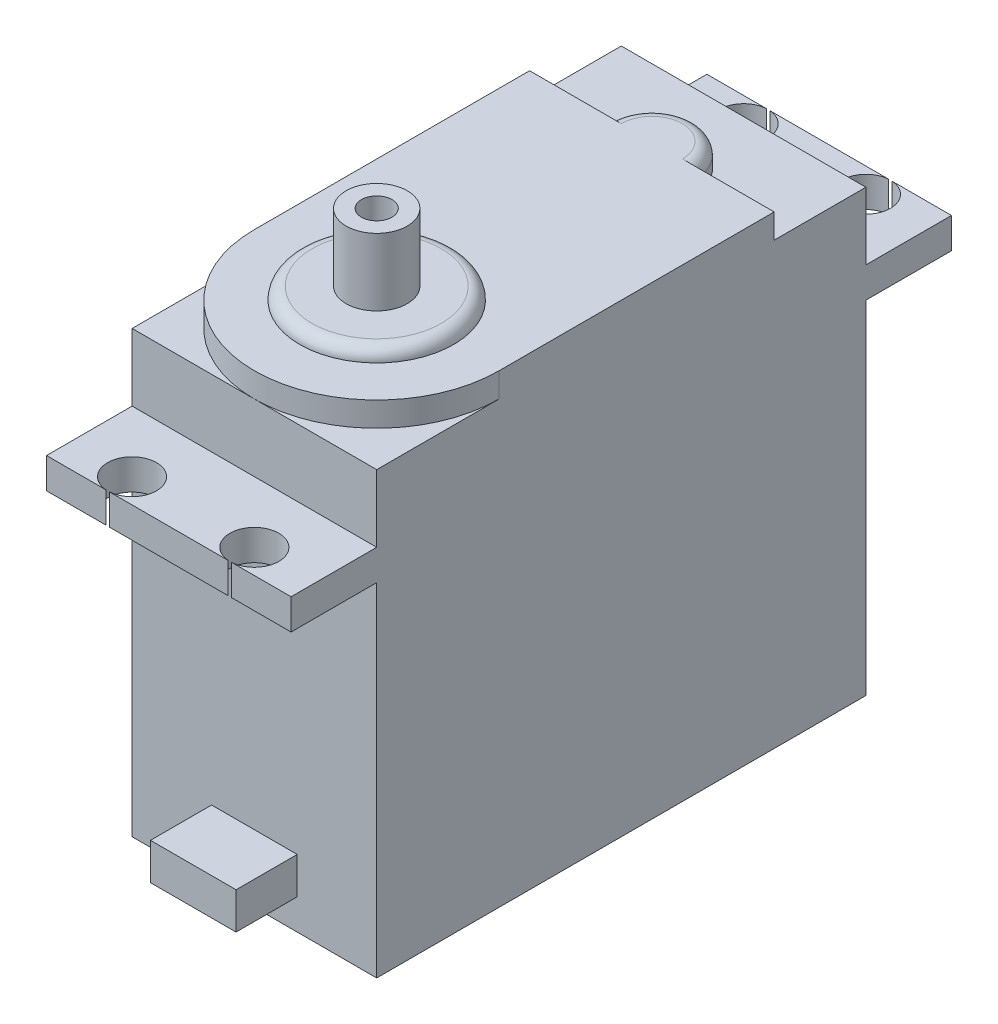
ISO-10303-21;
HEADER;
FILE_DESCRIPTION(('STEP AP214'),'2;1');
FILE_NAME('part.step','',(''),(''),'','','');
FILE_SCHEMA(('AUTOMOTIVE_DESIGN { 1 0 10303 214 1 1 1 1 }'));
ENDSEC;
DATA;
#1=APPLICATION_CONTEXT('core data for automotive mechanical design processes');
#2=APPLICATION_PROTOCOL_DEFINITION('international standard','automotive_design',2000,#1);
#3=PRODUCT_CONTEXT('',#1,'mechanical');
#4=PRODUCT('Part','Part','',(#3));
#5=PRODUCT_RELATED_PRODUCT_CATEGORY('part','',(#4));
#6=PRODUCT_DEFINITION_FORMATION('','',#4);
#7=PRODUCT_DEFINITION_CONTEXT('part definition',#1,'design');
#8=PRODUCT_DEFINITION('design','',#6,#7);
#9=PRODUCT_DEFINITION_SHAPE('','',#8);
#10=(LENGTH_UNIT() NAMED_UNIT(*) SI_UNIT(.MILLI.,.METRE.));
#11=(NAMED_UNIT(*) PLANE_ANGLE_UNIT() SI_UNIT($,.RADIAN.));
#12=(NAMED_UNIT(*) SI_UNIT($,.STERADIAN.) SOLID_ANGLE_UNIT());
#13=UNCERTAINTY_MEASURE_WITH_UNIT(LENGTH_MEASURE(1.E-05),#10,'distance_accuracy_value','');
#14=(GEOMETRIC_REPRESENTATION_CONTEXT(3) GLOBAL_UNCERTAINTY_ASSIGNED_CONTEXT((#13)) GLOBAL_UNIT_ASSIGNED_CONTEXT((#10,
#11,#12)) REPRESENTATION_CONTEXT('',''));
#15=CARTESIAN_POINT('',(0.,0.,0.));
#16=DIRECTION('',(0.,0.,1.));
#17=DIRECTION('',(1.,0.,0.));
#18=AXIS2_PLACEMENT_3D('',#15,#16,#17);
#19=CARTESIAN_POINT('',(0.,36.,0.));
#20=DIRECTION('',(0.,-1.,0.));
#21=DIRECTION('',(0.,0.,-1.));
#22=AXIS2_PLACEMENT_3D('',#19,#20,#21);
#23=PLANE('',#22);
#24=DIRECTION('',(-1.,0.,0.));
#25=VECTOR('',#24,1.);
#26=CARTESIAN_POINT('',(20.,36.,-32.5));
#27=LINE('',#26,#25);
#28=CARTESIAN_POINT('',(20.,36.,-32.5));
#29=VERTEX_POINT('',#28);
#30=CARTESIAN_POINT('',(13.5,36.,-32.5));
#31=VERTEX_POINT('',#30);
#32=EDGE_CURVE('E331',#29,#31,#27,.T.);
#33=ORIENTED_EDGE('',*,*,#32,.F.);
#34=DIRECTION('',(0.,0.,-1.));
#35=VECTOR('',#34,1.);
#36=CARTESIAN_POINT('',(20.,36.,0.));
#37=LINE('',#36,#35);
#38=CARTESIAN_POINT('',(20.,36.,-40.));
#39=VERTEX_POINT('',#38);
#40=EDGE_CURVE('E266',#29,#39,#37,.T.);
#41=ORIENTED_EDGE('',*,*,#40,.T.);
#42=DIRECTION('',(-1.,0.,0.));
#43=VECTOR('',#42,1.);
#44=CARTESIAN_POINT('',(0.,36.,-40.));
#45=LINE('',#44,#43);
#46=CARTESIAN_POINT('',(0.,36.,-40.));
#47=VERTEX_POINT('',#46);
#48=EDGE_CURVE('E491',#39,#47,#45,.T.);
#49=ORIENTED_EDGE('',*,*,#48,.T.);
#50=DIRECTION('',(0.,0.,1.));
#51=VECTOR('',#50,1.);
#52=CARTESIAN_POINT('',(0.,36.,0.));
#53=LINE('',#52,#51);
#54=CARTESIAN_POINT('',(0.,36.,-32.5));
#55=VERTEX_POINT('',#54);
#56=EDGE_CURVE('E398',#47,#55,#53,.T.);
#57=ORIENTED_EDGE('',*,*,#56,.T.);
#58=DIRECTION('',(-1.,0.,0.));
#59=VECTOR('',#58,1.);
#60=CARTESIAN_POINT('',(6.5,36.,-32.5));
#61=LINE('',#60,#59);
#62=CARTESIAN_POINT('',(6.5,36.,-32.5));
#63=VERTEX_POINT('',#62);
#64=EDGE_CURVE('E386',#63,#55,#61,.T.);
#65=ORIENTED_EDGE('',*,*,#64,.F.);
#66=CARTESIAN_POINT('',(10.,36.,-32.5));
#67=DIRECTION('',(0.,1.,0.));
#68=DIRECTION('',(0.,0.,1.));
#69=AXIS2_PLACEMENT_3D('',#66,#67,#68);
#70=CIRCLE('',#69,3.5);
#71=EDGE_CURVE('E419',#31,#63,#70,.T.);
#72=ORIENTED_EDGE('',*,*,#71,.F.);
#73=EDGE_LOOP('',(#33,#41,#49,#57,#65,#72));
#74=FACE_BOUND('',#73,.T.);
#75=ADVANCED_FACE('F36',(#74),#23,.F.);
#76=CARTESIAN_POINT('',(10.,36.,-10.));
#77=DIRECTION('',(0.,1.,0.));
#78=DIRECTION('',(0.,0.,1.));
#79=AXIS2_PLACEMENT_3D('',#76,#77,#78);
#80=CIRCLE('',#79,10.);
#81=CARTESIAN_POINT('',(0.,36.,-10.));
#82=VERTEX_POINT('',#81);
#83=CARTESIAN_POINT('',(10.,36.,0.));
#84=VERTEX_POINT('',#83);
#85=EDGE_CURVE('E260',#82,#84,#80,.T.);
#86=ORIENTED_EDGE('',*,*,#85,.F.);
#87=CARTESIAN_POINT('',(0.,36.,0.));
#88=VERTEX_POINT('',#87);
#89=EDGE_CURVE('E401',#82,#88,#53,.T.);
#90=ORIENTED_EDGE('',*,*,#89,.T.);
#91=DIRECTION('',(1.,0.,0.));
#92=VECTOR('',#91,1.);
#93=CARTESIAN_POINT('',(0.,36.,0.));
#94=LINE('',#93,#92);
#95=EDGE_CURVE('E393',#88,#84,#94,.T.);
#96=ORIENTED_EDGE('',*,*,#95,.T.);
#97=EDGE_LOOP('',(#86,#90,#96));
#98=FACE_BOUND('',#97,.T.);
#99=ADVANCED_FACE('F353',(#98),#23,.F.);
#100=CARTESIAN_POINT('',(0.,0.,-47.));
#101=DIRECTION('',(0.,0.,1.));
#102=DIRECTION('',(1.,0.,0.));
#103=AXIS2_PLACEMENT_3D('',#100,#101,#102);
#104=PLANE('',#103);
#105=DIRECTION('',(1.,0.,0.));
#106=VECTOR('',#105,1.);
#107=CARTESIAN_POINT('',(0.,28.,-47.));
#108=LINE('',#107,#106);
#109=CARTESIAN_POINT('',(5.14133294025114,28.,-47.));
#110=VERTEX_POINT('',#109);
#111=CARTESIAN_POINT('',(14.8586670597488,28.,-47.));
#112=VERTEX_POINT('',#111);
#113=EDGE_CURVE('E605',#110,#112,#108,.T.);
#114=ORIENTED_EDGE('',*,*,#113,.F.);
#115=DIRECTION('',(0.,1.,0.));
#116=VECTOR('',#115,1.);
#117=CARTESIAN_POINT('',(5.14133294025114,23.5,-47.));
#118=LINE('',#117,#116);
#119=CARTESIAN_POINT('',(5.14133294025114,30.5,-47.));
#120=VERTEX_POINT('',#119);
#121=EDGE_CURVE('E585',#110,#120,#118,.T.);
#122=ORIENTED_EDGE('',*,*,#121,.T.);
#123=DIRECTION('',(-1.,0.,0.));
#124=VECTOR('',#123,1.);
#125=CARTESIAN_POINT('',(0.,30.5,-47.));
#126=LINE('',#125,#124);
#127=CARTESIAN_POINT('',(14.8586670597488,30.5,-47.));
#128=VERTEX_POINT('',#127);
#129=EDGE_CURVE('E311',#128,#120,#126,.T.);
#130=ORIENTED_EDGE('',*,*,#129,.F.);
#131=DIRECTION('',(0.,1.,0.));
#132=VECTOR('',#131,1.);
#133=CARTESIAN_POINT('',(14.8586670597488,23.5,-47.));
#134=LINE('',#133,#132);
#135=EDGE_CURVE('E290',#128,#112,#134,.F.);
#136=ORIENTED_EDGE('',*,*,#135,.T.);
#137=EDGE_LOOP('',(#114,#122,#130,#136));
#138=FACE_BOUND('',#137,.T.);
#139=ADVANCED_FACE('F360',(#138),#104,.F.);
#140=CARTESIAN_POINT('',(15.1413329402512,28.,-47.));
#141=VERTEX_POINT('',#140);
#142=CARTESIAN_POINT('',(20.,28.,-47.));
#143=VERTEX_POINT('',#142);
#144=EDGE_CURVE('E552',#141,#143,#108,.T.);
#145=ORIENTED_EDGE('',*,*,#144,.F.);
#146=DIRECTION('',(0.,1.,0.));
#147=VECTOR('',#146,1.);
#148=CARTESIAN_POINT('',(15.1413329402512,23.5,-47.));
#149=LINE('',#148,#147);
#150=CARTESIAN_POINT('',(15.1413329402512,30.5,-47.));
#151=VERTEX_POINT('',#150);
#152=EDGE_CURVE('E286',#141,#151,#149,.T.);
#153=ORIENTED_EDGE('',*,*,#152,.T.);
#154=CARTESIAN_POINT('',(20.,30.5,-47.));
#155=VERTEX_POINT('',#154);
#156=EDGE_CURVE('E306',#155,#151,#126,.T.);
#157=ORIENTED_EDGE('',*,*,#156,.F.);
#158=DIRECTION('',(0.,1.,0.));
#159=VECTOR('',#158,1.);
#160=CARTESIAN_POINT('',(20.,30.5,-47.));
#161=LINE('',#160,#159);
#162=EDGE_CURVE('E316',#143,#155,#161,.T.);
#163=ORIENTED_EDGE('',*,*,#162,.F.);
#164=EDGE_LOOP('',(#145,#153,#157,#163));
#165=FACE_BOUND('',#164,.T.);
#166=ADVANCED_FACE('F614',(#165),#104,.F.);
#167=CARTESIAN_POINT('',(0.,0.,7.));
#168=DIRECTION('',(0.,0.,1.));
#169=DIRECTION('',(1.,0.,0.));
#170=AXIS2_PLACEMENT_3D('',#167,#168,#169);
#171=PLANE('',#170);
#172=DIRECTION('',(0.,1.,0.));
#173=VECTOR('',#172,1.);
#174=CARTESIAN_POINT('',(15.1413329402512,23.5,7.));
#175=LINE('',#174,#173);
#176=CARTESIAN_POINT('',(15.1413329402512,28.,7.));
#177=VERTEX_POINT('',#176);
#178=CARTESIAN_POINT('',(15.1413329402512,30.5,7.));
#179=VERTEX_POINT('',#178);
#180=EDGE_CURVE('E303',#177,#179,#175,.T.);
#181=ORIENTED_EDGE('',*,*,#180,.F.);
#182=DIRECTION('',(1.,0.,0.));
#183=VECTOR('',#182,1.);
#184=CARTESIAN_POINT('',(0.,28.,7.));
#185=LINE('',#184,#183);
#186=CARTESIAN_POINT('',(20.,28.,7.));
#187=VERTEX_POINT('',#186);
#188=EDGE_CURVE('E581',#177,#187,#185,.T.);
#189=ORIENTED_EDGE('',*,*,#188,.T.);
#190=DIRECTION('',(0.,1.,0.));
#191=VECTOR('',#190,1.);
#192=CARTESIAN_POINT('',(20.,30.5,7.));
#193=LINE('',#192,#191);
#194=CARTESIAN_POINT('',(20.,30.5,7.));
#195=VERTEX_POINT('',#194);
#196=EDGE_CURVE('E536',#187,#195,#193,.T.);
#197=ORIENTED_EDGE('',*,*,#196,.T.);
#198=DIRECTION('',(-1.,0.,0.));
#199=VECTOR('',#198,1.);
#200=CARTESIAN_POINT('',(0.,30.5,7.));
#201=LINE('',#200,#199);
#202=EDGE_CURVE('E545',#195,#179,#201,.T.);
#203=ORIENTED_EDGE('',*,*,#202,.T.);
#204=EDGE_LOOP('',(#181,#189,#197,#203));
#205=FACE_BOUND('',#204,.T.);
#206=ADVANCED_FACE('F670',(#205),#171,.T.);
#207=DIRECTION('',(0.,1.,0.));
#208=VECTOR('',#207,1.);
#209=CARTESIAN_POINT('',(14.8586670597488,23.5,7.));
#210=LINE('',#209,#208);
#211=CARTESIAN_POINT('',(14.8586670597488,30.5,7.));
#212=VERTEX_POINT('',#211);
#213=CARTESIAN_POINT('',(14.8586670597488,28.,7.));
#214=VERTEX_POINT('',#213);
#215=EDGE_CURVE('E295',#212,#214,#210,.F.);
#216=ORIENTED_EDGE('',*,*,#215,.F.);
#217=CARTESIAN_POINT('',(5.14133294025102,30.5,7.));
#218=VERTEX_POINT('',#217);
#219=EDGE_CURVE('E531',#212,#218,#201,.T.);
#220=ORIENTED_EDGE('',*,*,#219,.T.);
#221=DIRECTION('',(0.,1.,0.));
#222=VECTOR('',#221,1.);
#223=CARTESIAN_POINT('',(5.14133294025102,23.5,7.));
#224=LINE('',#223,#222);
#225=CARTESIAN_POINT('',(5.14133294025102,28.,7.));
#226=VERTEX_POINT('',#225);
#227=EDGE_CURVE('E530',#226,#218,#224,.T.);
#228=ORIENTED_EDGE('',*,*,#227,.F.);
#229=EDGE_CURVE('E580',#226,#214,#185,.T.);
#230=ORIENTED_EDGE('',*,*,#229,.T.);
#231=EDGE_LOOP('',(#216,#220,#228,#230));
#232=FACE_BOUND('',#231,.T.);
#233=ADVANCED_FACE('F558',(#232),#171,.T.);
#234=CARTESIAN_POINT('',(0.,36.,0.));
#235=DIRECTION('',(0.,0.,-1.));
#236=DIRECTION('',(-1.,0.,0.));
#237=AXIS2_PLACEMENT_3D('',#234,#235,#236);
#238=PLANE('',#237);
#239=DIRECTION('',(0.,-1.,0.));
#240=VECTOR('',#239,1.);
#241=CARTESIAN_POINT('',(0.,36.,0.));
#242=LINE('',#241,#240);
#243=CARTESIAN_POINT('',(0.,30.5,0.));
#244=VERTEX_POINT('',#243);
#245=EDGE_CURVE('E515',#88,#244,#242,.T.);
#246=ORIENTED_EDGE('',*,*,#245,.T.);
#247=DIRECTION('',(1.,0.,0.));
#248=VECTOR('',#247,1.);
#249=CARTESIAN_POINT('',(0.,30.5,0.));
#250=LINE('',#249,#248);
#251=CARTESIAN_POINT('',(20.,30.5,0.));
#252=VERTEX_POINT('',#251);
#253=EDGE_CURVE('E450',#244,#252,#250,.T.);
#254=ORIENTED_EDGE('',*,*,#253,.T.);
#255=DIRECTION('',(0.,-1.,0.));
#256=VECTOR('',#255,1.);
#257=CARTESIAN_POINT('',(20.,36.,0.));
#258=LINE('',#257,#256);
#259=CARTESIAN_POINT('',(20.,36.,0.));
#260=VERTEX_POINT('',#259);
#261=EDGE_CURVE('E397',#260,#252,#258,.T.);
#262=ORIENTED_EDGE('',*,*,#261,.F.);
#263=EDGE_CURVE('E380',#84,#260,#94,.T.);
#264=ORIENTED_EDGE('',*,*,#263,.F.);
#265=ORIENTED_EDGE('',*,*,#95,.F.);
#266=EDGE_LOOP('',(#246,#254,#262,#264,#265));
#267=FACE_BOUND('',#266,.T.);
#268=ADVANCED_FACE('F392',(#267),#238,.F.);
#269=CARTESIAN_POINT('',(0.,36.,-40.));
#270=DIRECTION('',(0.,0.,1.));
#271=DIRECTION('',(1.,0.,0.));
#272=AXIS2_PLACEMENT_3D('',#269,#270,#271);
#273=PLANE('',#272);
#274=DIRECTION('',(0.,-1.,0.));
#275=VECTOR('',#274,1.);
#276=CARTESIAN_POINT('',(20.,36.,-40.));
#277=LINE('',#276,#275);
#278=CARTESIAN_POINT('',(20.,30.5,-40.));
#279=VERTEX_POINT('',#278);
#280=EDGE_CURVE('E509',#39,#279,#277,.T.);
#281=ORIENTED_EDGE('',*,*,#280,.T.);
#282=DIRECTION('',(-1.,0.,0.));
#283=VECTOR('',#282,1.);
#284=CARTESIAN_POINT('',(0.,30.5,-40.));
#285=LINE('',#284,#283);
#286=CARTESIAN_POINT('',(0.,30.5,-40.));
#287=VERTEX_POINT('',#286);
#288=EDGE_CURVE('E520',#279,#287,#285,.T.);
#289=ORIENTED_EDGE('',*,*,#288,.T.);
#290=DIRECTION('',(0.,-1.,0.));
#291=VECTOR('',#290,1.);
#292=CARTESIAN_POINT('',(0.,36.,-40.));
#293=LINE('',#292,#291);
#294=EDGE_CURVE('E505',#47,#287,#293,.T.);
#295=ORIENTED_EDGE('',*,*,#294,.F.);
#296=ORIENTED_EDGE('',*,*,#48,.F.);
#297=EDGE_LOOP('',(#281,#289,#295,#296));
#298=FACE_BOUND('',#297,.T.);
#299=ADVANCED_FACE('F376',(#298),#273,.F.);
#300=CARTESIAN_POINT('',(20.,28.,0.));
#301=VERTEX_POINT('',#300);
#302=CARTESIAN_POINT('',(20.,0.,0.));
#303=VERTEX_POINT('',#302);
#304=EDGE_CURVE('E512',#301,#303,#258,.T.);
#305=ORIENTED_EDGE('',*,*,#304,.F.);
#306=DIRECTION('',(-1.,0.,0.));
#307=VECTOR('',#306,1.);
#308=CARTESIAN_POINT('',(0.,28.,0.));
#309=LINE('',#308,#307);
#310=CARTESIAN_POINT('',(0.,28.,0.));
#311=VERTEX_POINT('',#310);
#312=EDGE_CURVE('E455',#301,#311,#309,.T.);
#313=ORIENTED_EDGE('',*,*,#312,.T.);
#314=CARTESIAN_POINT('',(0.,0.,0.));
#315=VERTEX_POINT('',#314);
#316=EDGE_CURVE('E514',#311,#315,#242,.T.);
#317=ORIENTED_EDGE('',*,*,#316,.T.);
#318=DIRECTION('',(1.,0.,0.));
#319=VECTOR('',#318,1.);
#320=CARTESIAN_POINT('',(0.,0.,0.));
#321=LINE('',#320,#319);
#322=EDGE_CURVE('E496',#315,#303,#321,.T.);
#323=ORIENTED_EDGE('',*,*,#322,.T.);
#324=EDGE_LOOP('',(#305,#313,#317,#323));
#325=FACE_BOUND('',#324,.T.);
#326=DIRECTION('',(0.,-1.,0.));
#327=VECTOR('',#326,1.);
#328=CARTESIAN_POINT('',(6.5,2.5,0.));
#329=LINE('',#328,#327);
#330=CARTESIAN_POINT('',(6.5,5.5,0.));
#331=VERTEX_POINT('',#330);
#332=CARTESIAN_POINT('',(6.5,2.5,0.));
#333=VERTEX_POINT('',#332);
#334=EDGE_CURVE('E449',#331,#333,#329,.T.);
#335=ORIENTED_EDGE('',*,*,#334,.F.);
#336=DIRECTION('',(-1.,0.,0.));
#337=VECTOR('',#336,1.);
#338=CARTESIAN_POINT('',(6.5,5.5,0.));
#339=LINE('',#338,#337);
#340=CARTESIAN_POINT('',(13.5,5.5,0.));
#341=VERTEX_POINT('',#340);
#342=EDGE_CURVE('E463',#341,#331,#339,.T.);
#343=ORIENTED_EDGE('',*,*,#342,.F.);
#344=DIRECTION('',(0.,1.,0.));
#345=VECTOR('',#344,1.);
#346=CARTESIAN_POINT('',(13.5,2.5,0.));
#347=LINE('',#346,#345);
#348=CARTESIAN_POINT('',(13.5,2.5,0.));
#349=VERTEX_POINT('',#348);
#350=EDGE_CURVE('E472',#349,#341,#347,.T.);
#351=ORIENTED_EDGE('',*,*,#350,.F.);
#352=DIRECTION('',(1.,0.,0.));
#353=VECTOR('',#352,1.);
#354=CARTESIAN_POINT('',(6.5,2.5,0.));
#355=LINE('',#354,#353);
#356=EDGE_CURVE('E453',#333,#349,#355,.T.);
#357=ORIENTED_EDGE('',*,*,#356,.F.);
#358=EDGE_LOOP('',(#335,#343,#351,#357));
#359=FACE_BOUND('',#358,.T.);
#360=ADVANCED_FACE('F644',(#325,#359),#238,.F.);
#361=CARTESIAN_POINT('',(0.,36.,0.));
#362=DIRECTION('',(1.,0.,0.));
#363=DIRECTION('',(0.,0.,-1.));
#364=AXIS2_PLACEMENT_3D('',#361,#362,#363);
#365=PLANE('',#364);
#366=ORIENTED_EDGE('',*,*,#316,.F.);
#367=DIRECTION('',(0.,0.,1.));
#368=VECTOR('',#367,1.);
#369=CARTESIAN_POINT('',(0.,28.,-47.));
#370=LINE('',#369,#368);
#371=CARTESIAN_POINT('',(0.,28.,7.));
#372=VERTEX_POINT('',#371);
#373=EDGE_CURVE('E310',#311,#372,#370,.T.);
#374=ORIENTED_EDGE('',*,*,#373,.T.);
#375=DIRECTION('',(0.,-1.,0.));
#376=VECTOR('',#375,1.);
#377=CARTESIAN_POINT('',(0.,30.5,7.));
#378=LINE('',#377,#376);
#379=CARTESIAN_POINT('',(0.,30.5,7.));
#380=VERTEX_POINT('',#379);
#381=EDGE_CURVE('E578',#380,#372,#378,.T.);
#382=ORIENTED_EDGE('',*,*,#381,.F.);
#383=DIRECTION('',(0.,0.,1.));
#384=VECTOR('',#383,1.);
#385=CARTESIAN_POINT('',(0.,30.5,-47.));
#386=LINE('',#385,#384);
#387=EDGE_CURVE('E635',#244,#380,#386,.T.);
#388=ORIENTED_EDGE('',*,*,#387,.F.);
#389=ORIENTED_EDGE('',*,*,#245,.F.);
#390=ORIENTED_EDGE('',*,*,#89,.F.);
#391=DIRECTION('',(0.,-1.,0.));
#392=VECTOR('',#391,1.);
#393=CARTESIAN_POINT('',(0.,38.,-10.));
#394=LINE('',#393,#392);
#395=CARTESIAN_POINT('',(0.,38.,-10.));
#396=VERTEX_POINT('',#395);
#397=EDGE_CURVE('E405',#396,#82,#394,.T.);
#398=ORIENTED_EDGE('',*,*,#397,.F.);
#399=DIRECTION('',(0.,0.,1.));
#400=VECTOR('',#399,1.);
#401=CARTESIAN_POINT('',(0.,38.,-32.5));
#402=LINE('',#401,#400);
#403=CARTESIAN_POINT('',(0.,38.,-32.5));
#404=VERTEX_POINT('',#403);
#405=EDGE_CURVE('E425',#404,#396,#402,.T.);
#406=ORIENTED_EDGE('',*,*,#405,.F.);
#407=DIRECTION('',(0.,-1.,0.));
#408=VECTOR('',#407,1.);
#409=CARTESIAN_POINT('',(0.,38.,-32.5));
#410=LINE('',#409,#408);
#411=EDGE_CURVE('E412',#404,#55,#410,.T.);
#412=ORIENTED_EDGE('',*,*,#411,.T.);
#413=ORIENTED_EDGE('',*,*,#56,.F.);
#414=ORIENTED_EDGE('',*,*,#294,.T.);
#415=CARTESIAN_POINT('',(0.,30.5,-47.));
#416=VERTEX_POINT('',#415);
#417=EDGE_CURVE('E318',#416,#287,#386,.T.);
#418=ORIENTED_EDGE('',*,*,#417,.F.);
#419=DIRECTION('',(0.,-1.,0.));
#420=VECTOR('',#419,1.);
#421=CARTESIAN_POINT('',(0.,30.5,-47.));
#422=LINE('',#421,#420);
#423=CARTESIAN_POINT('',(0.,28.,-47.));
#424=VERTEX_POINT('',#423);
#425=EDGE_CURVE('E542',#416,#424,#422,.T.);
#426=ORIENTED_EDGE('',*,*,#425,.T.);
#427=CARTESIAN_POINT('',(0.,28.,-40.));
#428=VERTEX_POINT('',#427);
#429=EDGE_CURVE('E628',#424,#428,#370,.T.);
#430=ORIENTED_EDGE('',*,*,#429,.T.);
#431=CARTESIAN_POINT('',(0.,0.,-40.));
#432=VERTEX_POINT('',#431);
#433=EDGE_CURVE('E493',#428,#432,#293,.T.);
#434=ORIENTED_EDGE('',*,*,#433,.T.);
#435=DIRECTION('',(0.,0.,1.));
#436=VECTOR('',#435,1.);
#437=CARTESIAN_POINT('',(0.,0.,0.));
#438=LINE('',#437,#436);
#439=EDGE_CURVE('E488',#432,#315,#438,.T.);
#440=ORIENTED_EDGE('',*,*,#439,.T.);
#441=EDGE_LOOP('',(#366,#374,#382,#388,#389,#390,#398,#406,#412,#413,#414,#418,#426,#430,#434,#440));
#442=FACE_BOUND('',#441,.T.);
#443=ADVANCED_FACE('F639',(#442),#365,.F.);
#444=CARTESIAN_POINT('',(20.,36.,0.));
#445=DIRECTION('',(-1.,0.,0.));
#446=DIRECTION('',(0.,0.,1.));
#447=AXIS2_PLACEMENT_3D('',#444,#445,#446);
#448=PLANE('',#447);
#449=CARTESIAN_POINT('',(20.,28.,-40.));
#450=VERTEX_POINT('',#449);
#451=CARTESIAN_POINT('',(20.,0.,-40.));
#452=VERTEX_POINT('',#451);
#453=EDGE_CURVE('E508',#450,#452,#277,.T.);
#454=ORIENTED_EDGE('',*,*,#453,.F.);
#455=DIRECTION('',(0.,0.,1.));
#456=VECTOR('',#455,1.);
#457=CARTESIAN_POINT('',(20.,28.,-47.));
#458=LINE('',#457,#456);
#459=EDGE_CURVE('E624',#143,#450,#458,.T.);
#460=ORIENTED_EDGE('',*,*,#459,.F.);
#461=ORIENTED_EDGE('',*,*,#162,.T.);
#462=DIRECTION('',(0.,0.,1.));
#463=VECTOR('',#462,1.);
#464=CARTESIAN_POINT('',(20.,30.5,-47.));
#465=LINE('',#464,#463);
#466=EDGE_CURVE('E623',#155,#279,#465,.T.);
#467=ORIENTED_EDGE('',*,*,#466,.T.);
#468=ORIENTED_EDGE('',*,*,#280,.F.);
#469=ORIENTED_EDGE('',*,*,#40,.F.);
#470=DIRECTION('',(0.,-1.,0.));
#471=VECTOR('',#470,1.);
#472=CARTESIAN_POINT('',(20.,38.,-32.5));
#473=LINE('',#472,#471);
#474=CARTESIAN_POINT('',(20.,38.,-32.5));
#475=VERTEX_POINT('',#474);
#476=EDGE_CURVE('E245',#475,#29,#473,.T.);
#477=ORIENTED_EDGE('',*,*,#476,.F.);
#478=DIRECTION('',(0.,0.,-1.));
#479=VECTOR('',#478,1.);
#480=CARTESIAN_POINT('',(20.,38.,-32.5));
#481=LINE('',#480,#479);
#482=CARTESIAN_POINT('',(20.,38.,-10.));
#483=VERTEX_POINT('',#482);
#484=EDGE_CURVE('E251',#483,#475,#481,.T.);
#485=ORIENTED_EDGE('',*,*,#484,.F.);
#486=DIRECTION('',(0.,-1.,0.));
#487=VECTOR('',#486,1.);
#488=CARTESIAN_POINT('',(20.,38.,-10.));
#489=LINE('',#488,#487);
#490=CARTESIAN_POINT('',(20.,36.,-10.));
#491=VERTEX_POINT('',#490);
#492=EDGE_CURVE('E409',#483,#491,#489,.T.);
#493=ORIENTED_EDGE('',*,*,#492,.T.);
#494=EDGE_CURVE('E383',#260,#491,#37,.T.);
#495=ORIENTED_EDGE('',*,*,#494,.F.);
#496=ORIENTED_EDGE('',*,*,#261,.T.);
#497=EDGE_CURVE('E625',#252,#195,#465,.T.);
#498=ORIENTED_EDGE('',*,*,#497,.T.);
#499=ORIENTED_EDGE('',*,*,#196,.F.);
#500=EDGE_CURVE('E626',#301,#187,#458,.T.);
#501=ORIENTED_EDGE('',*,*,#500,.F.);
#502=ORIENTED_EDGE('',*,*,#304,.T.);
#503=DIRECTION('',(0.,0.,-1.));
#504=VECTOR('',#503,1.);
#505=CARTESIAN_POINT('',(20.,0.,0.));
#506=LINE('',#505,#504);
#507=EDGE_CURVE('E499',#303,#452,#506,.T.);
#508=ORIENTED_EDGE('',*,*,#507,.T.);
#509=EDGE_LOOP('',(#454,#460,#461,#467,#468,#469,#477,#485,#493,#495,#496,#498,#499,#501,#502,#508));
#510=FACE_BOUND('',#509,.T.);
#511=ADVANCED_FACE('F264',(#510),#448,.F.);
#512=ORIENTED_EDGE('',*,*,#433,.F.);
#513=DIRECTION('',(1.,0.,0.));
#514=VECTOR('',#513,1.);
#515=CARTESIAN_POINT('',(0.,28.,-40.));
#516=LINE('',#515,#514);
#517=EDGE_CURVE('E517',#428,#450,#516,.T.);
#518=ORIENTED_EDGE('',*,*,#517,.T.);
#519=ORIENTED_EDGE('',*,*,#453,.T.);
#520=DIRECTION('',(-1.,0.,0.));
#521=VECTOR('',#520,1.);
#522=CARTESIAN_POINT('',(0.,0.,-40.));
#523=LINE('',#522,#521);
#524=EDGE_CURVE('E502',#452,#432,#523,.T.);
#525=ORIENTED_EDGE('',*,*,#524,.T.);
#526=EDGE_LOOP('',(#512,#518,#519,#525));
#527=FACE_BOUND('',#526,.T.);
#528=ADVANCED_FACE('F366',(#527),#273,.F.);
#529=EDGE_CURVE('E378',#84,#491,#80,.T.);
#530=ORIENTED_EDGE('',*,*,#529,.F.);
#531=ORIENTED_EDGE('',*,*,#263,.T.);
#532=ORIENTED_EDGE('',*,*,#494,.T.);
#533=EDGE_LOOP('',(#530,#531,#532));
#534=FACE_BOUND('',#533,.T.);
#535=ADVANCED_FACE('F356',(#534),#23,.F.);
#536=CARTESIAN_POINT('',(0.,0.,0.));
#537=DIRECTION('',(0.,-1.,0.));
#538=DIRECTION('',(0.,0.,-1.));
#539=AXIS2_PLACEMENT_3D('',#536,#537,#538);
#540=PLANE('',#539);
#541=ORIENTED_EDGE('',*,*,#439,.F.);
#542=ORIENTED_EDGE('',*,*,#524,.F.);
#543=ORIENTED_EDGE('',*,*,#507,.F.);
#544=ORIENTED_EDGE('',*,*,#322,.F.);
#545=EDGE_LOOP('',(#541,#542,#543,#544));
#546=FACE_BOUND('',#545,.T.);
#547=ADVANCED_FACE('F365',(#546),#540,.T.);
#548=CARTESIAN_POINT('',(6.5,2.5,5.));
#549=DIRECTION('',(1.,0.,0.));
#550=DIRECTION('',(0.,0.,-1.));
#551=AXIS2_PLACEMENT_3D('',#548,#549,#550);
#552=PLANE('',#551);
#553=ORIENTED_EDGE('',*,*,#334,.T.);
#554=DIRECTION('',(0.,0.,-1.));
#555=VECTOR('',#554,1.);
#556=CARTESIAN_POINT('',(6.5,2.5,5.));
#557=LINE('',#556,#555);
#558=CARTESIAN_POINT('',(6.5,2.5,5.));
#559=VERTEX_POINT('',#558);
#560=EDGE_CURVE('E485',#559,#333,#557,.T.);
#561=ORIENTED_EDGE('',*,*,#560,.F.);
#562=DIRECTION('',(0.,-1.,0.));
#563=VECTOR('',#562,1.);
#564=CARTESIAN_POINT('',(6.5,2.5,5.));
#565=LINE('',#564,#563);
#566=CARTESIAN_POINT('',(6.5,5.5,5.));
#567=VERTEX_POINT('',#566);
#568=EDGE_CURVE('E459',#567,#559,#565,.T.);
#569=ORIENTED_EDGE('',*,*,#568,.F.);
#570=DIRECTION('',(0.,0.,-1.));
#571=VECTOR('',#570,1.);
#572=CARTESIAN_POINT('',(6.5,5.5,5.));
#573=LINE('',#572,#571);
#574=EDGE_CURVE('E468',#567,#331,#573,.T.);
#575=ORIENTED_EDGE('',*,*,#574,.T.);
#576=EDGE_LOOP('',(#553,#561,#569,#575));
#577=FACE_BOUND('',#576,.T.);
#578=ADVANCED_FACE('F372',(#577),#552,.F.);
#579=CARTESIAN_POINT('',(6.5,2.5,5.));
#580=DIRECTION('',(0.,1.,0.));
#581=DIRECTION('',(0.,0.,1.));
#582=AXIS2_PLACEMENT_3D('',#579,#580,#581);
#583=PLANE('',#582);
#584=ORIENTED_EDGE('',*,*,#356,.T.);
#585=DIRECTION('',(0.,0.,-1.));
#586=VECTOR('',#585,1.);
#587=CARTESIAN_POINT('',(13.5,2.5,5.));
#588=LINE('',#587,#586);
#589=CARTESIAN_POINT('',(13.5,2.5,5.));
#590=VERTEX_POINT('',#589);
#591=EDGE_CURVE('E482',#590,#349,#588,.T.);
#592=ORIENTED_EDGE('',*,*,#591,.F.);
#593=DIRECTION('',(1.,0.,0.));
#594=VECTOR('',#593,1.);
#595=CARTESIAN_POINT('',(6.5,2.5,5.));
#596=LINE('',#595,#594);
#597=EDGE_CURVE('E462',#559,#590,#596,.T.);
#598=ORIENTED_EDGE('',*,*,#597,.F.);
#599=ORIENTED_EDGE('',*,*,#560,.T.);
#600=EDGE_LOOP('',(#584,#592,#598,#599));
#601=FACE_BOUND('',#600,.T.);
#602=ADVANCED_FACE('F698',(#601),#583,.F.);
#603=CARTESIAN_POINT('',(13.5,2.5,5.));
#604=DIRECTION('',(-1.,0.,0.));
#605=DIRECTION('',(0.,0.,1.));
#606=AXIS2_PLACEMENT_3D('',#603,#604,#605);
#607=PLANE('',#606);
#608=ORIENTED_EDGE('',*,*,#350,.T.);
#609=DIRECTION('',(0.,0.,-1.));
#610=VECTOR('',#609,1.);
#611=CARTESIAN_POINT('',(13.5,5.5,5.));
#612=LINE('',#611,#610);
#613=CARTESIAN_POINT('',(13.5,5.5,5.));
#614=VERTEX_POINT('',#613);
#615=EDGE_CURVE('E479',#614,#341,#612,.T.);
#616=ORIENTED_EDGE('',*,*,#615,.F.);
#617=DIRECTION('',(0.,1.,0.));
#618=VECTOR('',#617,1.);
#619=CARTESIAN_POINT('',(13.5,2.5,5.));
#620=LINE('',#619,#618);
#621=EDGE_CURVE('E465',#590,#614,#620,.T.);
#622=ORIENTED_EDGE('',*,*,#621,.F.);
#623=ORIENTED_EDGE('',*,*,#591,.T.);
#624=EDGE_LOOP('',(#608,#616,#622,#623));
#625=FACE_BOUND('',#624,.T.);
#626=ADVANCED_FACE('F694',(#625),#607,.F.);
#627=CARTESIAN_POINT('',(6.5,5.5,5.));
#628=DIRECTION('',(0.,-1.,0.));
#629=DIRECTION('',(0.,0.,-1.));
#630=AXIS2_PLACEMENT_3D('',#627,#628,#629);
#631=PLANE('',#630);
#632=ORIENTED_EDGE('',*,*,#342,.T.);
#633=ORIENTED_EDGE('',*,*,#574,.F.);
#634=DIRECTION('',(-1.,0.,0.));
#635=VECTOR('',#634,1.);
#636=CARTESIAN_POINT('',(6.5,5.5,5.));
#637=LINE('',#636,#635);
#638=EDGE_CURVE('E467',#614,#567,#637,.T.);
#639=ORIENTED_EDGE('',*,*,#638,.F.);
#640=ORIENTED_EDGE('',*,*,#615,.T.);
#641=EDGE_LOOP('',(#632,#633,#639,#640));
#642=FACE_BOUND('',#641,.T.);
#643=ADVANCED_FACE('F663',(#642),#631,.F.);
#644=CARTESIAN_POINT('',(0.,0.,5.));
#645=DIRECTION('',(0.,0.,-1.));
#646=DIRECTION('',(-1.,0.,0.));
#647=AXIS2_PLACEMENT_3D('',#644,#645,#646);
#648=PLANE('',#647);
#649=ORIENTED_EDGE('',*,*,#568,.T.);
#650=ORIENTED_EDGE('',*,*,#597,.T.);
#651=ORIENTED_EDGE('',*,*,#621,.T.);
#652=ORIENTED_EDGE('',*,*,#638,.T.);
#653=EDGE_LOOP('',(#649,#650,#651,#652));
#654=FACE_BOUND('',#653,.T.);
#655=ADVANCED_FACE('F656',(#654),#648,.F.);
#656=CARTESIAN_POINT('',(4.85866705974886,30.5,-47.));
#657=VERTEX_POINT('',#656);
#658=EDGE_CURVE('E323',#657,#416,#126,.T.);
#659=ORIENTED_EDGE('',*,*,#658,.F.);
#660=DIRECTION('',(0.,1.,0.));
#661=VECTOR('',#660,1.);
#662=CARTESIAN_POINT('',(4.85866705974886,23.5,-47.));
#663=LINE('',#662,#661);
#664=CARTESIAN_POINT('',(4.85866705974886,28.,-47.));
#665=VERTEX_POINT('',#664);
#666=EDGE_CURVE('E587',#657,#665,#663,.F.);
#667=ORIENTED_EDGE('',*,*,#666,.T.);
#668=EDGE_CURVE('E619',#424,#665,#108,.T.);
#669=ORIENTED_EDGE('',*,*,#668,.F.);
#670=ORIENTED_EDGE('',*,*,#425,.F.);
#671=EDGE_LOOP('',(#659,#667,#669,#670));
#672=FACE_BOUND('',#671,.T.);
#673=ADVANCED_FACE('F654',(#672),#104,.F.);
#674=CARTESIAN_POINT('',(0.,28.,-47.));
#675=DIRECTION('',(0.,-1.,0.));
#676=DIRECTION('',(0.,0.,-1.));
#677=AXIS2_PLACEMENT_3D('',#674,#675,#676);
#678=PLANE('',#677);
#679=CARTESIAN_POINT('',(5.,28.,-45.005));
#680=DIRECTION('',(0.,-1.,0.));
#681=DIRECTION('',(0.,0.,-1.));
#682=AXIS2_PLACEMENT_3D('',#679,#680,#681);
#683=CIRCLE('',#682,2.00000000000001);
#684=EDGE_CURVE('E282',#110,#665,#683,.T.);
#685=ORIENTED_EDGE('',*,*,#684,.F.);
#686=ORIENTED_EDGE('',*,*,#113,.T.);
#687=CARTESIAN_POINT('',(15.,28.,-45.005));
#688=DIRECTION('',(0.,-1.,0.));
#689=DIRECTION('',(0.,0.,-1.));
#690=AXIS2_PLACEMENT_3D('',#687,#688,#689);
#691=CIRCLE('',#690,2.00000000000001);
#692=EDGE_CURVE('E1001',#141,#112,#691,.T.);
#693=ORIENTED_EDGE('',*,*,#692,.F.);
#694=ORIENTED_EDGE('',*,*,#144,.T.);
#695=ORIENTED_EDGE('',*,*,#459,.T.);
#696=ORIENTED_EDGE('',*,*,#517,.F.);
#697=ORIENTED_EDGE('',*,*,#429,.F.);
#698=ORIENTED_EDGE('',*,*,#668,.T.);
#699=EDGE_LOOP('',(#685,#686,#693,#694,#695,#696,#697,#698));
#700=FACE_BOUND('',#699,.T.);
#701=ADVANCED_FACE('F651',(#700),#678,.T.);
#702=CARTESIAN_POINT('',(0.,30.5,-47.));
#703=DIRECTION('',(0.,1.,0.));
#704=DIRECTION('',(0.,0.,1.));
#705=AXIS2_PLACEMENT_3D('',#702,#703,#704);
#706=PLANE('',#705);
#707=CARTESIAN_POINT('',(5.,30.5,-45.005));
#708=DIRECTION('',(0.,1.,0.));
#709=DIRECTION('',(0.,0.,1.));
#710=AXIS2_PLACEMENT_3D('',#707,#708,#709);
#711=CIRCLE('',#710,2.00000000000001);
#712=EDGE_CURVE('E302',#657,#120,#711,.T.);
#713=ORIENTED_EDGE('',*,*,#712,.F.);
#714=ORIENTED_EDGE('',*,*,#658,.T.);
#715=ORIENTED_EDGE('',*,*,#417,.T.);
#716=ORIENTED_EDGE('',*,*,#288,.F.);
#717=ORIENTED_EDGE('',*,*,#466,.F.);
#718=ORIENTED_EDGE('',*,*,#156,.T.);
#719=CARTESIAN_POINT('',(15.,30.5,-45.005));
#720=DIRECTION('',(0.,1.,0.));
#721=DIRECTION('',(0.,0.,1.));
#722=AXIS2_PLACEMENT_3D('',#719,#720,#721);
#723=CIRCLE('',#722,2.00000000000001);
#724=EDGE_CURVE('E300',#128,#151,#723,.T.);
#725=ORIENTED_EDGE('',*,*,#724,.F.);
#726=ORIENTED_EDGE('',*,*,#129,.T.);
#727=EDGE_LOOP('',(#713,#714,#715,#716,#717,#718,#725,#726));
#728=FACE_BOUND('',#727,.T.);
#729=ADVANCED_FACE('F607',(#728),#706,.T.);
#730=CARTESIAN_POINT('',(15.,30.5,5.005));
#731=DIRECTION('',(0.,1.,0.));
#732=DIRECTION('',(0.,0.,1.));
#733=AXIS2_PLACEMENT_3D('',#730,#731,#732);
#734=CIRCLE('',#733,2.00000000000001);
#735=EDGE_CURVE('E270',#179,#212,#734,.T.);
#736=ORIENTED_EDGE('',*,*,#735,.F.);
#737=ORIENTED_EDGE('',*,*,#202,.F.);
#738=ORIENTED_EDGE('',*,*,#497,.F.);
#739=ORIENTED_EDGE('',*,*,#253,.F.);
#740=ORIENTED_EDGE('',*,*,#387,.T.);
#741=CARTESIAN_POINT('',(4.85866705974899,30.5,7.));
#742=VERTEX_POINT('',#741);
#743=EDGE_CURVE('E534',#742,#380,#201,.T.);
#744=ORIENTED_EDGE('',*,*,#743,.F.);
#745=CARTESIAN_POINT('',(5.,30.5,5.005));
#746=DIRECTION('',(0.,1.,0.));
#747=DIRECTION('',(0.,0.,1.));
#748=AXIS2_PLACEMENT_3D('',#745,#746,#747);
#749=CIRCLE('',#748,2.);
#750=EDGE_CURVE('E267',#218,#742,#749,.T.);
#751=ORIENTED_EDGE('',*,*,#750,.F.);
#752=ORIENTED_EDGE('',*,*,#219,.F.);
#753=EDGE_LOOP('',(#736,#737,#738,#739,#740,#744,#751,#752));
#754=FACE_BOUND('',#753,.T.);
#755=ADVANCED_FACE('F564',(#754),#706,.T.);
#756=CARTESIAN_POINT('',(15.,28.,5.005));
#757=DIRECTION('',(0.,-1.,0.));
#758=DIRECTION('',(0.,0.,-1.));
#759=AXIS2_PLACEMENT_3D('',#756,#757,#758);
#760=CIRCLE('',#759,2.00000000000001);
#761=EDGE_CURVE('E998',#214,#177,#760,.T.);
#762=ORIENTED_EDGE('',*,*,#761,.F.);
#763=ORIENTED_EDGE('',*,*,#229,.F.);
#764=CARTESIAN_POINT('',(5.,28.,5.005));
#765=DIRECTION('',(0.,-1.,0.));
#766=DIRECTION('',(0.,0.,-1.));
#767=AXIS2_PLACEMENT_3D('',#764,#765,#766);
#768=CIRCLE('',#767,2.);
#769=CARTESIAN_POINT('',(4.85866705974899,28.,7.));
#770=VERTEX_POINT('',#769);
#771=EDGE_CURVE('E285',#770,#226,#768,.T.);
#772=ORIENTED_EDGE('',*,*,#771,.F.);
#773=EDGE_CURVE('E576',#372,#770,#185,.T.);
#774=ORIENTED_EDGE('',*,*,#773,.F.);
#775=ORIENTED_EDGE('',*,*,#373,.F.);
#776=ORIENTED_EDGE('',*,*,#312,.F.);
#777=ORIENTED_EDGE('',*,*,#500,.T.);
#778=ORIENTED_EDGE('',*,*,#188,.F.);
#779=EDGE_LOOP('',(#762,#763,#772,#774,#775,#776,#777,#778));
#780=FACE_BOUND('',#779,.T.);
#781=ADVANCED_FACE('F641',(#780),#678,.T.);
#782=DIRECTION('',(0.,1.,0.));
#783=VECTOR('',#782,1.);
#784=CARTESIAN_POINT('',(4.85866705974899,23.5,7.));
#785=LINE('',#784,#783);
#786=EDGE_CURVE('E523',#742,#770,#785,.F.);
#787=ORIENTED_EDGE('',*,*,#786,.F.);
#788=ORIENTED_EDGE('',*,*,#743,.T.);
#789=ORIENTED_EDGE('',*,*,#381,.T.);
#790=ORIENTED_EDGE('',*,*,#773,.T.);
#791=EDGE_LOOP('',(#787,#788,#789,#790));
#792=FACE_BOUND('',#791,.T.);
#793=ADVANCED_FACE('F573',(#792),#171,.T.);
#794=CARTESIAN_POINT('',(5.,23.5,5.005));
#795=DIRECTION('',(0.,1.,0.));
#796=DIRECTION('',(0.,0.,1.));
#797=AXIS2_PLACEMENT_3D('',#794,#795,#796);
#798=CYLINDRICAL_SURFACE('',#797,2.);
#799=ORIENTED_EDGE('',*,*,#227,.T.);
#800=ORIENTED_EDGE('',*,*,#750,.T.);
#801=ORIENTED_EDGE('',*,*,#786,.T.);
#802=ORIENTED_EDGE('',*,*,#771,.T.);
#803=EDGE_LOOP('',(#799,#800,#801,#802));
#804=FACE_BOUND('',#803,.T.);
#805=ADVANCED_FACE('F569',(#804),#798,.F.);
#806=CARTESIAN_POINT('',(15.,23.5,5.005));
#807=DIRECTION('',(0.,1.,0.));
#808=DIRECTION('',(0.,0.,1.));
#809=AXIS2_PLACEMENT_3D('',#806,#807,#808);
#810=CYLINDRICAL_SURFACE('',#809,2.00000000000001);
#811=ORIENTED_EDGE('',*,*,#180,.T.);
#812=ORIENTED_EDGE('',*,*,#735,.T.);
#813=ORIENTED_EDGE('',*,*,#215,.T.);
#814=ORIENTED_EDGE('',*,*,#761,.T.);
#815=EDGE_LOOP('',(#811,#812,#813,#814));
#816=FACE_BOUND('',#815,.T.);
#817=ADVANCED_FACE('F683',(#816),#810,.F.);
#818=CARTESIAN_POINT('',(15.,23.5,-45.005));
#819=DIRECTION('',(0.,1.,0.));
#820=DIRECTION('',(0.,0.,1.));
#821=AXIS2_PLACEMENT_3D('',#818,#819,#820);
#822=CYLINDRICAL_SURFACE('',#821,2.00000000000001);
#823=ORIENTED_EDGE('',*,*,#692,.T.);
#824=ORIENTED_EDGE('',*,*,#135,.F.);
#825=ORIENTED_EDGE('',*,*,#724,.T.);
#826=ORIENTED_EDGE('',*,*,#152,.F.);
#827=EDGE_LOOP('',(#823,#824,#825,#826));
#828=FACE_BOUND('',#827,.T.);
#829=ADVANCED_FACE('F610',(#828),#822,.F.);
#830=CARTESIAN_POINT('',(5.,23.5,-45.005));
#831=DIRECTION('',(0.,1.,0.));
#832=DIRECTION('',(0.,0.,1.));
#833=AXIS2_PLACEMENT_3D('',#830,#831,#832);
#834=CYLINDRICAL_SURFACE('',#833,2.00000000000001);
#835=ORIENTED_EDGE('',*,*,#684,.T.);
#836=ORIENTED_EDGE('',*,*,#666,.F.);
#837=ORIENTED_EDGE('',*,*,#712,.T.);
#838=ORIENTED_EDGE('',*,*,#121,.F.);
#839=EDGE_LOOP('',(#835,#836,#837,#838));
#840=FACE_BOUND('',#839,.T.);
#841=ADVANCED_FACE('F595',(#840),#834,.F.);
#842=CARTESIAN_POINT('',(20.,38.,-32.5));
#843=DIRECTION('',(0.,0.,1.));
#844=DIRECTION('',(1.,0.,0.));
#845=AXIS2_PLACEMENT_3D('',#842,#843,#844);
#846=PLANE('',#845);
#847=ORIENTED_EDGE('',*,*,#32,.T.);
#848=DIRECTION('',(0.,-1.,0.));
#849=VECTOR('',#848,1.);
#850=CARTESIAN_POINT('',(13.5,38.,-32.5));
#851=LINE('',#850,#849);
#852=CARTESIAN_POINT('',(13.5,37.,-32.5));
#853=VERTEX_POINT('',#852);
#854=EDGE_CURVE('E268',#853,#31,#851,.T.);
#855=ORIENTED_EDGE('',*,*,#854,.F.);
#856=CARTESIAN_POINT('',(12.5,37.,-32.5));
#857=DIRECTION('',(0.,0.,1.));
#858=DIRECTION('',(1.,0.,0.));
#859=AXIS2_PLACEMENT_3D('',#856,#857,#858);
#860=CIRCLE('',#859,1.);
#861=CARTESIAN_POINT('',(12.5,38.,-32.5));
#862=VERTEX_POINT('',#861);
#863=EDGE_CURVE('E11',#853,#862,#860,.T.);
#864=ORIENTED_EDGE('',*,*,#863,.T.);
#865=DIRECTION('',(-1.,0.,0.));
#866=VECTOR('',#865,1.);
#867=CARTESIAN_POINT('',(20.,38.,-32.5));
#868=LINE('',#867,#866);
#869=EDGE_CURVE('E240',#475,#862,#868,.T.);
#870=ORIENTED_EDGE('',*,*,#869,.F.);
#871=ORIENTED_EDGE('',*,*,#476,.T.);
#872=EDGE_LOOP('',(#847,#855,#864,#870,#871));
#873=FACE_BOUND('',#872,.T.);
#874=ADVANCED_FACE('F243',(#873),#846,.F.);
#875=CARTESIAN_POINT('',(10.,38.,-32.5));
#876=DIRECTION('',(0.,-1.,0.));
#877=DIRECTION('',(0.,0.,-1.));
#878=AXIS2_PLACEMENT_3D('',#875,#876,#877);
#879=CYLINDRICAL_SURFACE('',#878,3.5);
#880=DIRECTION('',(0.,-1.,0.));
#881=VECTOR('',#880,1.);
#882=CARTESIAN_POINT('',(6.5,38.,-32.5));
#883=LINE('',#882,#881);
#884=CARTESIAN_POINT('',(6.5,37.,-32.5));
#885=VERTEX_POINT('',#884);
#886=EDGE_CURVE('E272',#885,#63,#883,.T.);
#887=ORIENTED_EDGE('',*,*,#886,.F.);
#888=CARTESIAN_POINT('',(10.,37.,-32.5));
#889=DIRECTION('',(0.,1.,0.));
#890=DIRECTION('',(0.,0.,1.));
#891=AXIS2_PLACEMENT_3D('',#888,#889,#890);
#892=CIRCLE('',#891,3.5);
#893=EDGE_CURVE('E51',#885,#853,#892,.F.);
#894=ORIENTED_EDGE('',*,*,#893,.T.);
#895=ORIENTED_EDGE('',*,*,#854,.T.);
#896=ORIENTED_EDGE('',*,*,#71,.T.);
#897=EDGE_LOOP('',(#887,#894,#895,#896));
#898=FACE_BOUND('',#897,.T.);
#899=ADVANCED_FACE('F421',(#898),#879,.T.);
#900=CARTESIAN_POINT('',(6.5,38.,-32.5));
#901=DIRECTION('',(0.,0.,1.));
#902=DIRECTION('',(1.,0.,0.));
#903=AXIS2_PLACEMENT_3D('',#900,#901,#902);
#904=PLANE('',#903);
#905=ORIENTED_EDGE('',*,*,#64,.T.);
#906=ORIENTED_EDGE('',*,*,#411,.F.);
#907=DIRECTION('',(-1.,0.,0.));
#908=VECTOR('',#907,1.);
#909=CARTESIAN_POINT('',(6.5,38.,-32.5));
#910=LINE('',#909,#908);
#911=CARTESIAN_POINT('',(7.5,38.,-32.5));
#912=VERTEX_POINT('',#911);
#913=EDGE_CURVE('E250',#912,#404,#910,.T.);
#914=ORIENTED_EDGE('',*,*,#913,.F.);
#915=CARTESIAN_POINT('',(7.5,37.,-32.5));
#916=DIRECTION('',(0.,0.,1.));
#917=DIRECTION('',(1.,0.,0.));
#918=AXIS2_PLACEMENT_3D('',#915,#916,#917);
#919=CIRCLE('',#918,1.);
#920=EDGE_CURVE('E44',#912,#885,#919,.T.);
#921=ORIENTED_EDGE('',*,*,#920,.T.);
#922=ORIENTED_EDGE('',*,*,#886,.T.);
#923=EDGE_LOOP('',(#905,#906,#914,#921,#922));
#924=FACE_BOUND('',#923,.T.);
#925=ADVANCED_FACE('F416',(#924),#904,.F.);
#926=CARTESIAN_POINT('',(10.,38.,-10.));
#927=DIRECTION('',(0.,-1.,0.));
#928=DIRECTION('',(0.,0.,-1.));
#929=AXIS2_PLACEMENT_3D('',#926,#927,#928);
#930=CYLINDRICAL_SURFACE('',#929,10.);
#931=ORIENTED_EDGE('',*,*,#85,.T.);
#932=ORIENTED_EDGE('',*,*,#529,.T.);
#933=ORIENTED_EDGE('',*,*,#492,.F.);
#934=CARTESIAN_POINT('',(10.,38.,-10.));
#935=DIRECTION('',(0.,1.,0.));
#936=DIRECTION('',(0.,0.,1.));
#937=AXIS2_PLACEMENT_3D('',#934,#935,#936);
#938=CIRCLE('',#937,10.);
#939=EDGE_CURVE('E256',#396,#483,#938,.T.);
#940=ORIENTED_EDGE('',*,*,#939,.F.);
#941=ORIENTED_EDGE('',*,*,#397,.T.);
#942=EDGE_LOOP('',(#931,#932,#933,#940,#941));
#943=FACE_BOUND('',#942,.T.);
#944=ADVANCED_FACE('F403',(#943),#930,.T.);
#945=CARTESIAN_POINT('',(10.,38.,-10.));
#946=DIRECTION('',(0.,1.,0.));
#947=DIRECTION('',(0.,0.,1.));
#948=AXIS2_PLACEMENT_3D('',#945,#946,#947);
#949=PLANE('',#948);
#950=CARTESIAN_POINT('',(10.,38.,-10.));
#951=DIRECTION('',(0.,1.,0.));
#952=DIRECTION('',(0.,0.,1.));
#953=AXIS2_PLACEMENT_3D('',#950,#951,#952);
#954=CIRCLE('',#953,6.28945461064793);
#955=CARTESIAN_POINT('',(10.,38.,-3.71054538935207));
#956=VERTEX_POINT('',#955);
#957=EDGE_CURVE('E332',#956,#956,#954,.T.);
#958=ORIENTED_EDGE('',*,*,#957,.F.);
#959=EDGE_LOOP('',(#958));
#960=FACE_BOUND('',#959,.T.);
#961=CARTESIAN_POINT('',(10.,38.,-32.5));
#962=DIRECTION('',(0.,1.,0.));
#963=DIRECTION('',(0.,0.,1.));
#964=AXIS2_PLACEMENT_3D('',#961,#962,#963);
#965=CIRCLE('',#964,2.5);
#966=EDGE_CURVE('E336',#862,#912,#965,.T.);
#967=ORIENTED_EDGE('',*,*,#966,.T.);
#968=ORIENTED_EDGE('',*,*,#913,.T.);
#969=ORIENTED_EDGE('',*,*,#405,.T.);
#970=ORIENTED_EDGE('',*,*,#939,.T.);
#971=ORIENTED_EDGE('',*,*,#484,.T.);
#972=ORIENTED_EDGE('',*,*,#869,.T.);
#973=EDGE_LOOP('',(#967,#968,#969,#970,#971,#972));
#974=FACE_BOUND('',#973,.T.);
#975=ADVANCED_FACE('F254',(#960,#974),#949,.T.);
#976=CARTESIAN_POINT('',(10.,39.,-10.));
#977=DIRECTION('',(0.,1.,0.));
#978=DIRECTION('',(0.,0.,1.));
#979=AXIS2_PLACEMENT_3D('',#976,#977,#978);
#980=PLANE('',#979);
#981=CARTESIAN_POINT('',(10.,39.,-10.));
#982=DIRECTION('',(0.,1.,0.));
#983=DIRECTION('',(0.,0.,1.));
#984=AXIS2_PLACEMENT_3D('',#981,#982,#983);
#985=CIRCLE('',#984,5.28945461064793);
#986=CARTESIAN_POINT('',(10.,39.,-4.71054538935207));
#987=VERTEX_POINT('',#986);
#988=EDGE_CURVE('E333',#987,#987,#985,.T.);
#989=ORIENTED_EDGE('',*,*,#988,.T.);
#990=EDGE_LOOP('',(#989));
#991=FACE_BOUND('',#990,.T.);
#992=CARTESIAN_POINT('',(10.,39.,-10.));
#993=DIRECTION('',(0.,1.,0.));
#994=DIRECTION('',(0.,0.,1.));
#995=AXIS2_PLACEMENT_3D('',#992,#993,#994);
#996=CIRCLE('',#995,2.5);
#997=CARTESIAN_POINT('',(10.,39.,-7.5));
#998=VERTEX_POINT('',#997);
#999=EDGE_CURVE('E328',#998,#998,#996,.T.);
#1000=ORIENTED_EDGE('',*,*,#999,.F.);
#1001=EDGE_LOOP('',(#1000));
#1002=FACE_BOUND('',#1001,.T.);
#1003=ADVANCED_FACE('F443',(#991,#1002),#980,.T.);
#1004=CARTESIAN_POINT('',(10.,44.5,-10.));
#1005=DIRECTION('',(0.,1.,0.));
#1006=DIRECTION('',(0.,0.,1.));
#1007=AXIS2_PLACEMENT_3D('',#1004,#1005,#1006);
#1008=PLANE('',#1007);
#1009=CARTESIAN_POINT('',(10.,44.5,-10.));
#1010=DIRECTION('',(0.,1.,0.));
#1011=DIRECTION('',(0.,0.,1.));
#1012=AXIS2_PLACEMENT_3D('',#1009,#1010,#1011);
#1013=CIRCLE('',#1012,1.25);
#1014=CARTESIAN_POINT('',(10.,44.5,-8.75));
#1015=VERTEX_POINT('',#1014);
#1016=EDGE_CURVE('E431',#1015,#1015,#1013,.T.);
#1017=ORIENTED_EDGE('',*,*,#1016,.F.);
#1018=EDGE_LOOP('',(#1017));
#1019=FACE_BOUND('',#1018,.T.);
#1020=CARTESIAN_POINT('',(10.,44.5,-10.));
#1021=DIRECTION('',(0.,1.,0.));
#1022=DIRECTION('',(0.,0.,1.));
#1023=AXIS2_PLACEMENT_3D('',#1020,#1021,#1022);
#1024=CIRCLE('',#1023,2.5);
#1025=CARTESIAN_POINT('',(10.,44.5,-7.5));
#1026=VERTEX_POINT('',#1025);
#1027=EDGE_CURVE('E447',#1026,#1026,#1024,.T.);
#1028=ORIENTED_EDGE('',*,*,#1027,.T.);
#1029=EDGE_LOOP('',(#1028));
#1030=FACE_BOUND('',#1029,.T.);
#1031=ADVANCED_FACE('F440',(#1019,#1030),#1008,.T.);
#1032=CARTESIAN_POINT('',(10.,44.5,-10.));
#1033=DIRECTION('',(0.,-1.,0.));
#1034=DIRECTION('',(0.,0.,-1.));
#1035=AXIS2_PLACEMENT_3D('',#1032,#1033,#1034);
#1036=CYLINDRICAL_SURFACE('',#1035,2.5);
#1037=ORIENTED_EDGE('',*,*,#999,.T.);
#1038=EDGE_LOOP('',(#1037));
#1039=FACE_BOUND('',#1038,.T.);
#1040=ORIENTED_EDGE('',*,*,#1027,.F.);
#1041=EDGE_LOOP('',(#1040));
#1042=FACE_BOUND('',#1041,.T.);
#1043=ADVANCED_FACE('F350',(#1039,#1042),#1036,.T.);
#1044=CARTESIAN_POINT('',(10.,38.,-10.));
#1045=DIRECTION('',(0.,1.,0.));
#1046=DIRECTION('',(0.,0.,1.));
#1047=AXIS2_PLACEMENT_3D('',#1044,#1045,#1046);
#1048=TOROIDAL_SURFACE('',#1047,5.28945461064793,1.);
#1049=ORIENTED_EDGE('',*,*,#957,.T.);
#1050=EDGE_LOOP('',(#1049));
#1051=FACE_BOUND('',#1050,.T.);
#1052=ORIENTED_EDGE('',*,*,#988,.F.);
#1053=EDGE_LOOP('',(#1052));
#1054=FACE_BOUND('',#1053,.T.);
#1055=ADVANCED_FACE('F342',(#1051,#1054),#1048,.T.);
#1056=CARTESIAN_POINT('',(10.,37.,-32.5));
#1057=DIRECTION('',(0.,1.,0.));
#1058=DIRECTION('',(0.,0.,1.));
#1059=AXIS2_PLACEMENT_3D('',#1056,#1057,#1058);
#1060=TOROIDAL_SURFACE('',#1059,2.5,1.);
#1061=ORIENTED_EDGE('',*,*,#863,.F.);
#1062=ORIENTED_EDGE('',*,*,#893,.F.);
#1063=ORIENTED_EDGE('',*,*,#920,.F.);
#1064=ORIENTED_EDGE('',*,*,#966,.F.);
#1065=EDGE_LOOP('',(#1061,#1062,#1063,#1064));
#1066=FACE_BOUND('',#1065,.T.);
#1067=ADVANCED_FACE('F38',(#1066),#1060,.T.);
#1068=CARTESIAN_POINT('',(10.,39.5,-10.));
#1069=DIRECTION('',(0.,1.,0.));
#1070=DIRECTION('',(0.,0.,1.));
#1071=AXIS2_PLACEMENT_3D('',#1068,#1069,#1070);
#1072=CYLINDRICAL_SURFACE('',#1071,1.25);
#1073=CARTESIAN_POINT('',(10.,39.5,-10.));
#1074=DIRECTION('',(0.,1.,0.));
#1075=DIRECTION('',(0.,0.,1.));
#1076=AXIS2_PLACEMENT_3D('',#1073,#1074,#1075);
#1077=CIRCLE('',#1076,1.25);
#1078=CARTESIAN_POINT('',(10.,39.5,-8.75));
#1079=VERTEX_POINT('',#1078);
#1080=EDGE_CURVE('E430',#1079,#1079,#1077,.T.);
#1081=ORIENTED_EDGE('',*,*,#1080,.F.);
#1082=EDGE_LOOP('',(#1081));
#1083=FACE_BOUND('',#1082,.T.);
#1084=ORIENTED_EDGE('',*,*,#1016,.T.);
#1085=EDGE_LOOP('',(#1084));
#1086=FACE_BOUND('',#1085,.T.);
#1087=ADVANCED_FACE('F341',(#1083,#1086),#1072,.F.);
#1088=CARTESIAN_POINT('',(10.,39.5,-10.));
#1089=DIRECTION('',(0.,1.,0.));
#1090=DIRECTION('',(0.,0.,1.));
#1091=AXIS2_PLACEMENT_3D('',#1088,#1089,#1090);
#1092=PLANE('',#1091);
#1093=ORIENTED_EDGE('',*,*,#1080,.T.);
#1094=EDGE_LOOP('',(#1093));
#1095=FACE_BOUND('',#1094,.T.);
#1096=ADVANCED_FACE('F347',(#1095),#1092,.T.);
#1097=CLOSED_SHELL('',(#75,#99,#139,#166,#206,#233,#268,#299,#360,#443,#511,#528,#535,#547,#578,
#602,#626,#643,#655,#673,#701,#729,#755,#781,#793,#805,#817,#829,#841,#874,#899,#925,#944,#975,
#1003,#1031,#1043,#1055,#1067,#1087,#1096));
#1098=MANIFOLD_SOLID_BREP('B2',#1097);
#1099=ADVANCED_BREP_SHAPE_REPRESENTATION('',(#18,#1098),#14);
#1100=SHAPE_DEFINITION_REPRESENTATION(#9,#1099);
ENDSEC;
END-ISO-10303-21;
